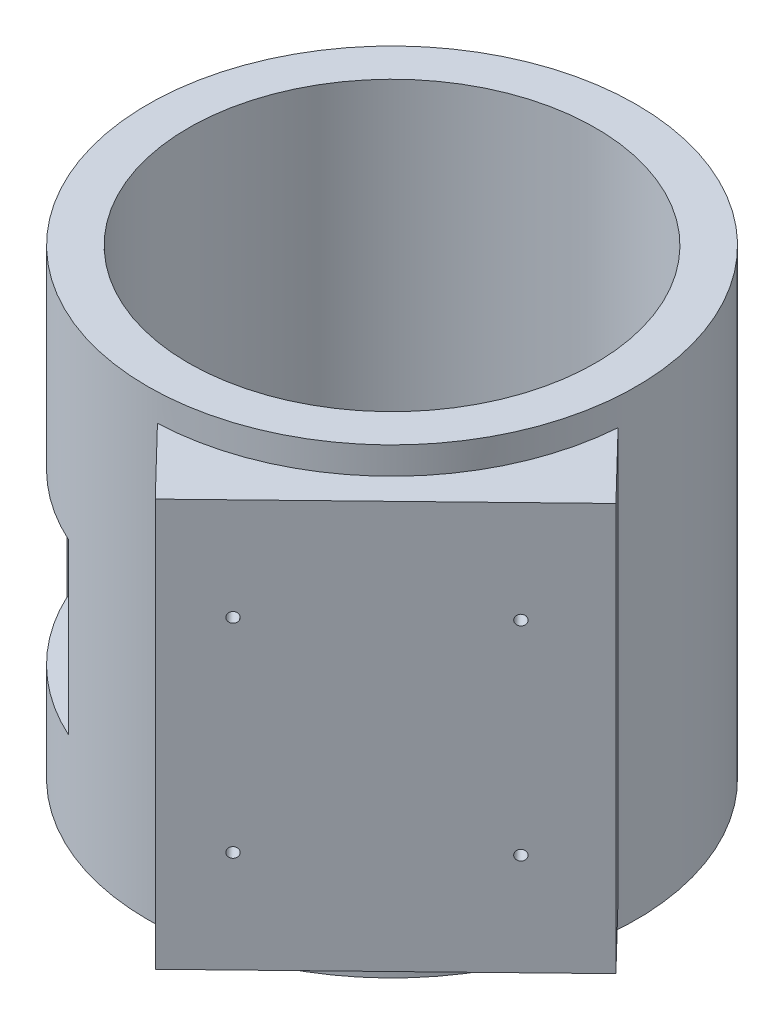
ISO-10303-21;
HEADER;
FILE_DESCRIPTION(('STEP AP214'),'2;1');
FILE_NAME('part.step','',(''),(''),'','','');
FILE_SCHEMA(('AUTOMOTIVE_DESIGN { 1 0 10303 214 1 1 1 1 }'));
ENDSEC;
DATA;
#1=APPLICATION_CONTEXT('core data for automotive mechanical design processes');
#2=APPLICATION_PROTOCOL_DEFINITION('international standard','automotive_design',2000,#1);
#3=PRODUCT_CONTEXT('',#1,'mechanical');
#4=PRODUCT('Part','Part','',(#3));
#5=PRODUCT_RELATED_PRODUCT_CATEGORY('part','',(#4));
#6=PRODUCT_DEFINITION_FORMATION('','',#4);
#7=PRODUCT_DEFINITION_CONTEXT('part definition',#1,'design');
#8=PRODUCT_DEFINITION('design','',#6,#7);
#9=PRODUCT_DEFINITION_SHAPE('','',#8);
#10=(LENGTH_UNIT() NAMED_UNIT(*) SI_UNIT(.MILLI.,.METRE.));
#11=(NAMED_UNIT(*) PLANE_ANGLE_UNIT() SI_UNIT($,.RADIAN.));
#12=(NAMED_UNIT(*) SI_UNIT($,.STERADIAN.) SOLID_ANGLE_UNIT());
#13=UNCERTAINTY_MEASURE_WITH_UNIT(LENGTH_MEASURE(1.E-05),#10,'distance_accuracy_value','');
#14=(GEOMETRIC_REPRESENTATION_CONTEXT(3) GLOBAL_UNCERTAINTY_ASSIGNED_CONTEXT((#13)) GLOBAL_UNIT_ASSIGNED_CONTEXT((#10,
#11,#12)) REPRESENTATION_CONTEXT('',''));
#15=CARTESIAN_POINT('',(0.,0.,0.));
#16=DIRECTION('',(0.,0.,1.));
#17=DIRECTION('',(1.,0.,0.));
#18=AXIS2_PLACEMENT_3D('',#15,#16,#17);
#19=CARTESIAN_POINT('',(0.,226.75,0.));
#20=DIRECTION('',(0.,1.,0.));
#21=DIRECTION('',(0.,0.,1.));
#22=AXIS2_PLACEMENT_3D('',#19,#20,#21);
#23=PLANE('',#22);
#24=CARTESIAN_POINT('',(0.,226.75,0.));
#25=DIRECTION('',(0.,1.,0.));
#26=DIRECTION('',(0.,0.,1.));
#27=AXIS2_PLACEMENT_3D('',#24,#25,#26);
#28=CIRCLE('',#27,120.);
#29=CARTESIAN_POINT('',(0.,226.75,120.));
#30=VERTEX_POINT('',#29);
#31=EDGE_CURVE('E187',#30,#30,#28,.T.);
#32=ORIENTED_EDGE('',*,*,#31,.T.);
#33=EDGE_LOOP('',(#32));
#34=FACE_BOUND('',#33,.T.);
#35=CARTESIAN_POINT('',(0.,226.75,0.));
#36=DIRECTION('',(0.,1.,0.));
#37=DIRECTION('',(0.,0.,1.));
#38=AXIS2_PLACEMENT_3D('',#35,#36,#37);
#39=CIRCLE('',#38,100.);
#40=CARTESIAN_POINT('',(0.,226.75,100.));
#41=VERTEX_POINT('',#40);
#42=EDGE_CURVE('E178',#41,#41,#39,.T.);
#43=ORIENTED_EDGE('',*,*,#42,.F.);
#44=EDGE_LOOP('',(#43));
#45=FACE_BOUND('',#44,.T.);
#46=ADVANCED_FACE('F35',(#34,#45),#23,.T.);
#47=CARTESIAN_POINT('',(0.,0.,0.));
#48=DIRECTION('',(0.,1.,0.));
#49=DIRECTION('',(0.,0.,1.));
#50=AXIS2_PLACEMENT_3D('',#47,#48,#49);
#51=PLANE('',#50);
#52=CARTESIAN_POINT('',(78.4325905729144,0.,-69.9186831342492));
#53=DIRECTION('',(0.,-1.,0.));
#54=DIRECTION('',(0.,0.,-1.));
#55=AXIS2_PLACEMENT_3D('',#52,#53,#54);
#56=CIRCLE('',#55,5.00000000000002);
#57=CARTESIAN_POINT('',(78.4325905729144,0.,-74.9186831342493));
#58=VERTEX_POINT('',#57);
#59=EDGE_CURVE('E369',#58,#58,#56,.T.);
#60=ORIENTED_EDGE('',*,*,#59,.F.);
#61=EDGE_LOOP('',(#60));
#62=FACE_BOUND('',#61,.T.);
#63=CARTESIAN_POINT('',(73.5102920280524,0.,78.4921351272082));
#64=DIRECTION('',(0.,-1.,0.));
#65=DIRECTION('',(0.,0.,-1.));
#66=AXIS2_PLACEMENT_3D('',#63,#64,#65);
#67=CIRCLE('',#66,5.00000000000001);
#68=CARTESIAN_POINT('',(73.5102920280524,0.,73.4921351272082));
#69=VERTEX_POINT('',#68);
#70=EDGE_CURVE('E368',#69,#69,#67,.T.);
#71=ORIENTED_EDGE('',*,*,#70,.F.);
#72=EDGE_LOOP('',(#71));
#73=FACE_BOUND('',#72,.T.);
#74=CARTESIAN_POINT('',(0.,0.,0.));
#75=DIRECTION('',(0.,1.,0.));
#76=DIRECTION('',(0.,0.,1.));
#77=AXIS2_PLACEMENT_3D('',#74,#75,#76);
#78=CIRCLE('',#77,120.);
#79=CARTESIAN_POINT('',(0.,0.,120.));
#80=VERTEX_POINT('',#79);
#81=EDGE_CURVE('E182',#80,#80,#78,.T.);
#82=ORIENTED_EDGE('',*,*,#81,.F.);
#83=EDGE_LOOP('',(#82));
#84=FACE_BOUND('',#83,.T.);
#85=CARTESIAN_POINT('',(0.,0.,0.));
#86=DIRECTION('',(0.,1.,0.));
#87=DIRECTION('',(0.,0.,1.));
#88=AXIS2_PLACEMENT_3D('',#85,#86,#87);
#89=CIRCLE('',#88,100.);
#90=CARTESIAN_POINT('',(-71.1105775900295,0.,70.3085041429015));
#91=VERTEX_POINT('',#90);
#92=CARTESIAN_POINT('',(-65.0944073913111,0.,-75.9125689617604));
#93=VERTEX_POINT('',#92);
#94=EDGE_CURVE('E179',#91,#93,#89,.T.);
#95=ORIENTED_EDGE('',*,*,#94,.T.);
#96=CARTESIAN_POINT('',(-69.9782276885435,0.,-74.8409816791089));
#97=DIRECTION('',(0.,-1.,0.));
#98=DIRECTION('',(0.,0.,-1.));
#99=AXIS2_PLACEMENT_3D('',#96,#97,#98);
#100=CIRCLE('',#99,5.00000000000001);
#101=CARTESIAN_POINT('',(-71.3750107303439,0.,-70.0400445691127));
#102=VERTEX_POINT('',#101);
#103=EDGE_CURVE('E177',#102,#93,#100,.T.);
#104=ORIENTED_EDGE('',*,*,#103,.F.);
#105=CARTESIAN_POINT('',(-71.5717871138831,0.,69.8389525216766));
#106=VERTEX_POINT('',#105);
#107=EDGE_CURVE('E171',#102,#106,#89,.T.);
#108=ORIENTED_EDGE('',*,*,#107,.T.);
#109=CARTESIAN_POINT('',(-74.900526233403,0.,73.5698365823488));
#110=DIRECTION('',(0.,-1.,0.));
#111=DIRECTION('',(0.,0.,-1.));
#112=AXIS2_PLACEMENT_3D('',#109,#110,#111);
#113=CIRCLE('',#112,5.00000000000001);
#114=EDGE_CURVE('E152',#91,#106,#113,.T.);
#115=ORIENTED_EDGE('',*,*,#114,.F.);
#116=EDGE_LOOP('',(#95,#104,#108,#115));
#117=FACE_BOUND('',#116,.T.);
#118=ADVANCED_FACE('F176',(#62,#73,#84,#117),#51,.F.);
#119=CARTESIAN_POINT('',(0.,226.75,0.));
#120=DIRECTION('',(0.,-1.,0.));
#121=DIRECTION('',(0.,0.,-1.));
#122=AXIS2_PLACEMENT_3D('',#119,#120,#121);
#123=CYLINDRICAL_SURFACE('',#122,120.);
#124=DIRECTION('',(0.,-1.,0.));
#125=VECTOR('',#124,1.);
#126=CARTESIAN_POINT('',(-108.663981558483,226.75,50.9130544345721));
#127=LINE('',#126,#125);
#128=CARTESIAN_POINT('',(-108.663981558483,48.41,50.9130544345721));
#129=VERTEX_POINT('',#128);
#130=CARTESIAN_POINT('',(-108.663981558483,131.41,50.9130544345721));
#131=VERTEX_POINT('',#130);
#132=EDGE_CURVE('E401',#129,#131,#127,.F.);
#133=ORIENTED_EDGE('',*,*,#132,.T.);
#134=CARTESIAN_POINT('',(0.,131.41,0.));
#135=DIRECTION('',(0.,1.,0.));
#136=DIRECTION('',(0.,0.,1.));
#137=AXIS2_PLACEMENT_3D('',#134,#135,#136);
#138=CIRCLE('',#137,120.);
#139=CARTESIAN_POINT('',(-49.608939813541,131.41,109.265516475128));
#140=VERTEX_POINT('',#139);
#141=EDGE_CURVE('E391',#131,#140,#138,.T.);
#142=ORIENTED_EDGE('',*,*,#141,.T.);
#143=DIRECTION('',(0.,-1.,0.));
#144=VECTOR('',#143,1.);
#145=CARTESIAN_POINT('',(-49.608939813541,226.75,109.265516475128));
#146=LINE('',#145,#144);
#147=CARTESIAN_POINT('',(-49.608939813541,48.41,109.265516475128));
#148=VERTEX_POINT('',#147);
#149=EDGE_CURVE('E202',#140,#148,#146,.T.);
#150=ORIENTED_EDGE('',*,*,#149,.T.);
#151=CARTESIAN_POINT('',(0.,48.41,0.));
#152=DIRECTION('',(0.,-1.,0.));
#153=DIRECTION('',(0.,0.,-1.));
#154=AXIS2_PLACEMENT_3D('',#151,#152,#153);
#155=CIRCLE('',#154,120.);
#156=EDGE_CURVE('E404',#148,#129,#155,.T.);
#157=ORIENTED_EDGE('',*,*,#156,.T.);
#158=EDGE_LOOP('',(#133,#142,#150,#157));
#159=FACE_BOUND('',#158,.T.);
#160=CARTESIAN_POINT('',(0.,213.414213562373,0.));
#161=DIRECTION('',(0.,1.,0.));
#162=DIRECTION('',(-1.,0.,0.));
#163=AXIS2_PLACEMENT_3D('',#160,#161,#162);
#164=CIRCLE('',#163,120.);
#165=CARTESIAN_POINT('',(4.6899926602656,213.414213562373,119.908314844495));
#166=VERTEX_POINT('',#165);
#167=CARTESIAN_POINT('',(119.686951655469,213.414213562374,8.66219391501968));
#168=VERTEX_POINT('',#167);
#169=EDGE_CURVE('E481',#166,#168,#164,.T.);
#170=ORIENTED_EDGE('',*,*,#169,.T.);
#171=DIRECTION('',(0.,-1.,0.));
#172=VECTOR('',#171,1.);
#173=CARTESIAN_POINT('',(119.686951655469,226.75,8.66219391501962));
#174=LINE('',#173,#172);
#175=CARTESIAN_POINT('',(119.686951655469,13.4142135623721,8.6621939150195));
#176=VERTEX_POINT('',#175);
#177=EDGE_CURVE('E184',#168,#176,#174,.T.);
#178=ORIENTED_EDGE('',*,*,#177,.T.);
#179=CARTESIAN_POINT('',(0.,13.4142135623726,0.));
#180=DIRECTION('',(0.,-1.,0.));
#181=DIRECTION('',(1.,0.,0.));
#182=AXIS2_PLACEMENT_3D('',#179,#180,#181);
#183=CIRCLE('',#182,120.);
#184=CARTESIAN_POINT('',(4.68999266026526,13.4142135623732,119.908314844496));
#185=VERTEX_POINT('',#184);
#186=EDGE_CURVE('E492',#176,#185,#183,.T.);
#187=ORIENTED_EDGE('',*,*,#186,.T.);
#188=DIRECTION('',(0.,-1.,0.));
#189=VECTOR('',#188,1.);
#190=CARTESIAN_POINT('',(4.68999266026567,226.75,119.908314844495));
#191=LINE('',#190,#189);
#192=EDGE_CURVE('E489',#185,#166,#191,.F.);
#193=ORIENTED_EDGE('',*,*,#192,.T.);
#194=EDGE_LOOP('',(#170,#178,#187,#193));
#195=FACE_BOUND('',#194,.T.);
#196=ORIENTED_EDGE('',*,*,#31,.F.);
#197=EDGE_LOOP('',(#196));
#198=FACE_BOUND('',#197,.T.);
#199=ORIENTED_EDGE('',*,*,#81,.T.);
#200=EDGE_LOOP('',(#199));
#201=FACE_BOUND('',#200,.T.);
#202=ADVANCED_FACE('F37',(#159,#195,#198,#201),#123,.T.);
#203=CARTESIAN_POINT('',(0.,226.75,0.));
#204=DIRECTION('',(0.,-1.,0.));
#205=DIRECTION('',(0.,0.,-1.));
#206=AXIS2_PLACEMENT_3D('',#203,#204,#205);
#207=CYLINDRICAL_SURFACE('',#206,100.);
#208=DIRECTION('',(0.,-1.,0.));
#209=VECTOR('',#208,1.);
#210=CARTESIAN_POINT('',(-65.0944073913111,10.,-75.9125689617604));
#211=LINE('',#210,#209);
#212=CARTESIAN_POINT('',(-65.0944073913111,20.,-75.9125689617604));
#213=VERTEX_POINT('',#212);
#214=EDGE_CURVE('E11',#93,#213,#211,.F.);
#215=ORIENTED_EDGE('',*,*,#214,.F.);
#216=ORIENTED_EDGE('',*,*,#94,.F.);
#217=DIRECTION('',(0.,-1.,0.));
#218=VECTOR('',#217,1.);
#219=CARTESIAN_POINT('',(-71.1105775900265,10.,70.308504142905));
#220=LINE('',#219,#218);
#221=CARTESIAN_POINT('',(-71.1105775900295,20.,70.3085041429015));
#222=VERTEX_POINT('',#221);
#223=EDGE_CURVE('E158',#222,#91,#220,.T.);
#224=ORIENTED_EDGE('',*,*,#223,.F.);
#225=CARTESIAN_POINT('',(0.,20.,0.));
#226=DIRECTION('',(0.,-1.,0.));
#227=DIRECTION('',(0.,0.,-1.));
#228=AXIS2_PLACEMENT_3D('',#225,#226,#227);
#229=CIRCLE('',#228,100.);
#230=CARTESIAN_POINT('',(-71.5717871138831,20.,69.8389525216766));
#231=VERTEX_POINT('',#230);
#232=EDGE_CURVE('E172',#222,#231,#229,.T.);
#233=ORIENTED_EDGE('',*,*,#232,.T.);
#234=DIRECTION('',(0.,-1.,0.));
#235=VECTOR('',#234,1.);
#236=CARTESIAN_POINT('',(-71.5717871138865,10.,69.8389525216736));
#237=LINE('',#236,#235);
#238=EDGE_CURVE('E155',#106,#231,#237,.F.);
#239=ORIENTED_EDGE('',*,*,#238,.F.);
#240=ORIENTED_EDGE('',*,*,#107,.F.);
#241=DIRECTION('',(0.,-1.,0.));
#242=VECTOR('',#241,1.);
#243=CARTESIAN_POINT('',(-71.3750107303439,10.,-70.0400445691127));
#244=LINE('',#243,#242);
#245=CARTESIAN_POINT('',(-71.3750107303439,20.,-70.0400445691127));
#246=VERTEX_POINT('',#245);
#247=EDGE_CURVE('E43',#246,#102,#244,.T.);
#248=ORIENTED_EDGE('',*,*,#247,.F.);
#249=CARTESIAN_POINT('',(0.,20.,0.));
#250=DIRECTION('',(0.,-1.,0.));
#251=DIRECTION('',(0.,0.,-1.));
#252=AXIS2_PLACEMENT_3D('',#249,#250,#251);
#253=CIRCLE('',#252,100.);
#254=EDGE_CURVE('E173',#246,#213,#253,.T.);
#255=ORIENTED_EDGE('',*,*,#254,.T.);
#256=EDGE_LOOP('',(#215,#216,#224,#233,#239,#240,#248,#255));
#257=FACE_BOUND('',#256,.T.);
#258=CARTESIAN_POINT('',(0.,48.41,0.));
#259=DIRECTION('',(0.,-1.,0.));
#260=DIRECTION('',(0.,0.,-1.));
#261=AXIS2_PLACEMENT_3D('',#258,#259,#260);
#262=CIRCLE('',#261,100.);
#263=CARTESIAN_POINT('',(-36.5772958110317,48.41,93.0704111474333));
#264=VERTEX_POINT('',#263);
#265=CARTESIAN_POINT('',(-93.2824171625184,48.41,36.0331881508964));
#266=VERTEX_POINT('',#265);
#267=EDGE_CURVE('E200',#264,#266,#262,.T.);
#268=ORIENTED_EDGE('',*,*,#267,.F.);
#269=DIRECTION('',(0.,-1.,0.));
#270=VECTOR('',#269,1.);
#271=CARTESIAN_POINT('',(-36.5772958110317,226.75,93.0704111474333));
#272=LINE('',#271,#270);
#273=CARTESIAN_POINT('',(-36.5772958110317,131.41,93.0704111474333));
#274=VERTEX_POINT('',#273);
#275=EDGE_CURVE('E190',#264,#274,#272,.F.);
#276=ORIENTED_EDGE('',*,*,#275,.T.);
#277=CARTESIAN_POINT('',(0.,131.41,0.));
#278=DIRECTION('',(0.,1.,0.));
#279=DIRECTION('',(0.,0.,1.));
#280=AXIS2_PLACEMENT_3D('',#277,#278,#279);
#281=CIRCLE('',#280,100.);
#282=CARTESIAN_POINT('',(-93.2824171625184,131.41,36.0331881508964));
#283=VERTEX_POINT('',#282);
#284=EDGE_CURVE('E195',#283,#274,#281,.T.);
#285=ORIENTED_EDGE('',*,*,#284,.F.);
#286=DIRECTION('',(0.,-1.,0.));
#287=VECTOR('',#286,1.);
#288=CARTESIAN_POINT('',(-93.2824171625184,226.75,36.0331881508963));
#289=LINE('',#288,#287);
#290=EDGE_CURVE('E198',#266,#283,#289,.F.);
#291=ORIENTED_EDGE('',*,*,#290,.F.);
#292=EDGE_LOOP('',(#268,#276,#285,#291));
#293=FACE_BOUND('',#292,.T.);
#294=ORIENTED_EDGE('',*,*,#42,.T.);
#295=EDGE_LOOP('',(#294));
#296=FACE_BOUND('',#295,.T.);
#297=CARTESIAN_POINT('',(0.,203.414213562373,0.));
#298=DIRECTION('',(0.,1.,0.));
#299=DIRECTION('',(0.,0.,1.));
#300=AXIS2_PLACEMENT_3D('',#297,#298,#299);
#301=CIRCLE('',#300,99.9999999999977);
#302=CARTESIAN_POINT('',(-0.657656399723929,203.414213562373,99.9978374169134));
#303=VERTEX_POINT('',#302);
#304=CARTESIAN_POINT('',(99.9646827210788,203.414213562373,2.65748160362182));
#305=VERTEX_POINT('',#304);
#306=EDGE_CURVE('E446',#303,#305,#301,.T.);
#307=ORIENTED_EDGE('',*,*,#306,.F.);
#308=DIRECTION('',(0.,1.,0.));
#309=VECTOR('',#308,1.);
#310=CARTESIAN_POINT('',(-0.657656399723934,0.,99.9978374169134));
#311=LINE('',#310,#309);
#312=CARTESIAN_POINT('',(-0.657656399723906,23.414213562373,99.9978374169134));
#313=VERTEX_POINT('',#312);
#314=EDGE_CURVE('E445',#313,#303,#311,.T.);
#315=ORIENTED_EDGE('',*,*,#314,.F.);
#316=CARTESIAN_POINT('',(0.,23.4142135623732,0.));
#317=DIRECTION('',(0.,-1.,0.));
#318=DIRECTION('',(1.,0.,0.));
#319=AXIS2_PLACEMENT_3D('',#316,#317,#318);
#320=CIRCLE('',#319,99.9999999999977);
#321=CARTESIAN_POINT('',(99.9646827210788,23.4142135623735,2.65748160362216));
#322=VERTEX_POINT('',#321);
#323=EDGE_CURVE('E442',#322,#313,#320,.T.);
#324=ORIENTED_EDGE('',*,*,#323,.F.);
#325=DIRECTION('',(0.,1.,0.));
#326=VECTOR('',#325,1.);
#327=CARTESIAN_POINT('',(99.9646827210788,0.,2.65748160362216));
#328=LINE('',#327,#326);
#329=EDGE_CURVE('E449',#305,#322,#328,.F.);
#330=ORIENTED_EDGE('',*,*,#329,.F.);
#331=EDGE_LOOP('',(#307,#315,#324,#330));
#332=FACE_BOUND('',#331,.T.);
#333=ADVANCED_FACE('F168',(#257,#293,#296,#332),#207,.F.);
#334=CARTESIAN_POINT('',(-67.6679309128779,23.4142135623732,-170.627129448513));
#335=DIRECTION('',(0.718730993720023,0.,-0.69528825580922));
#336=DIRECTION('',(-0.69528825580922,0.,-0.718730993720023));
#337=AXIS2_PLACEMENT_3D('',#334,#335,#336);
#338=PLANE('',#337);
#339=DIRECTION('',(0.69528825580922,0.,0.718730993720023));
#340=VECTOR('',#339,1.);
#341=CARTESIAN_POINT('',(-67.6679309128777,203.414213562373,-170.627129448514));
#342=LINE('',#341,#340);
#343=CARTESIAN_POINT('',(137.250013066787,203.414213562373,41.1999455481055));
#344=VERTEX_POINT('',#343);
#345=EDGE_CURVE('E474',#305,#344,#342,.T.);
#346=ORIENTED_EDGE('',*,*,#345,.F.);
#347=ORIENTED_EDGE('',*,*,#329,.T.);
#348=DIRECTION('',(0.69528825580922,0.,0.718730993720023));
#349=VECTOR('',#348,1.);
#350=CARTESIAN_POINT('',(-67.6679309128779,23.4142135623732,-170.627129448513));
#351=LINE('',#350,#349);
#352=CARTESIAN_POINT('',(137.250013066786,23.4142135623732,41.1999455481056));
#353=VERTEX_POINT('',#352);
#354=EDGE_CURVE('E466',#322,#353,#351,.T.);
#355=ORIENTED_EDGE('',*,*,#354,.T.);
#356=DIRECTION('',(0.,1.,0.));
#357=VECTOR('',#356,1.);
#358=CARTESIAN_POINT('',(137.250013066786,23.4142135623732,41.1999455481056));
#359=LINE('',#358,#357);
#360=EDGE_CURVE('E454',#353,#344,#359,.T.);
#361=ORIENTED_EDGE('',*,*,#360,.T.);
#362=EDGE_LOOP('',(#346,#347,#355,#361));
#363=FACE_BOUND('',#362,.T.);
#364=ADVANCED_FACE('F236',(#363),#338,.F.);
#365=CARTESIAN_POINT('',(-128.76006537908,203.414213562373,-111.52762770473));
#366=DIRECTION('',(0.,1.,0.));
#367=DIRECTION('',(0.,0.,1.));
#368=AXIS2_PLACEMENT_3D('',#365,#366,#367);
#369=PLANE('',#368);
#370=DIRECTION('',(0.69528825580922,0.,0.718730993720023));
#371=VECTOR('',#370,1.);
#372=CARTESIAN_POINT('',(-168.290270033681,203.414213562373,-73.2867736352227));
#373=LINE('',#372,#371);
#374=CARTESIAN_POINT('',(36.6276739459833,203.414213562373,138.540301361396));
#375=VERTEX_POINT('',#374);
#376=EDGE_CURVE('E471',#303,#375,#373,.T.);
#377=ORIENTED_EDGE('',*,*,#376,.F.);
#378=ORIENTED_EDGE('',*,*,#306,.T.);
#379=ORIENTED_EDGE('',*,*,#345,.T.);
#380=DIRECTION('',(-0.718730993720023,0.,0.69528825580922));
#381=VECTOR('',#380,1.);
#382=CARTESIAN_POINT('',(76.1578786005845,203.414213562373,100.299447291889));
#383=LINE('',#382,#381);
#384=EDGE_CURVE('E457',#344,#375,#383,.T.);
#385=ORIENTED_EDGE('',*,*,#384,.T.);
#386=EDGE_LOOP('',(#377,#378,#379,#385));
#387=FACE_BOUND('',#386,.T.);
#388=ADVANCED_FACE('F257',(#387),#369,.F.);
#389=CARTESIAN_POINT('',(-168.290270033681,203.414213562373,-73.2867736352227));
#390=DIRECTION('',(-0.718730993720023,0.,0.69528825580922));
#391=DIRECTION('',(0.69528825580922,0.,0.718730993720023));
#392=AXIS2_PLACEMENT_3D('',#389,#390,#391);
#393=PLANE('',#392);
#394=DIRECTION('',(0.69528825580922,0.,0.718730993720023));
#395=VECTOR('',#394,1.);
#396=CARTESIAN_POINT('',(-168.290270033681,23.414213562373,-73.2867736352227));
#397=LINE('',#396,#395);
#398=CARTESIAN_POINT('',(36.6276739459834,23.4142135623729,138.540301361396));
#399=VERTEX_POINT('',#398);
#400=EDGE_CURVE('E467',#313,#399,#397,.T.);
#401=ORIENTED_EDGE('',*,*,#400,.F.);
#402=ORIENTED_EDGE('',*,*,#314,.T.);
#403=ORIENTED_EDGE('',*,*,#376,.T.);
#404=DIRECTION('',(0.,-1.,0.));
#405=VECTOR('',#404,1.);
#406=CARTESIAN_POINT('',(36.6276739459832,203.414213562373,138.540301361396));
#407=LINE('',#406,#405);
#408=EDGE_CURVE('E460',#375,#399,#407,.T.);
#409=ORIENTED_EDGE('',*,*,#408,.T.);
#410=EDGE_LOOP('',(#401,#402,#403,#409));
#411=FACE_BOUND('',#410,.T.);
#412=ADVANCED_FACE('F261',(#411),#393,.F.);
#413=CARTESIAN_POINT('',(-168.290270033681,23.414213562373,-73.2867736352227));
#414=DIRECTION('',(0.,-1.,0.));
#415=DIRECTION('',(1.,0.,0.));
#416=AXIS2_PLACEMENT_3D('',#413,#414,#415);
#417=PLANE('',#416);
#418=ORIENTED_EDGE('',*,*,#354,.F.);
#419=ORIENTED_EDGE('',*,*,#323,.T.);
#420=ORIENTED_EDGE('',*,*,#400,.T.);
#421=DIRECTION('',(0.718730993720025,0.,-0.695288255809218));
#422=VECTOR('',#421,1.);
#423=CARTESIAN_POINT('',(36.627673945983,23.4142135623729,138.540301361396));
#424=LINE('',#423,#422);
#425=EDGE_CURVE('E463',#399,#353,#424,.T.);
#426=ORIENTED_EDGE('',*,*,#425,.T.);
#427=EDGE_LOOP('',(#418,#419,#420,#426));
#428=FACE_BOUND('',#427,.T.);
#429=ADVANCED_FACE('F247',(#428),#417,.F.);
#430=CARTESIAN_POINT('',(-60.4806209756777,213.414213562374,-177.580012006606));
#431=DIRECTION('',(0.718730993720023,0.,-0.69528825580922));
#432=DIRECTION('',(-0.69528825580922,0.,-0.718730993720023));
#433=AXIS2_PLACEMENT_3D('',#430,#431,#432);
#434=PLANE('',#433);
#435=ORIENTED_EDGE('',*,*,#177,.F.);
#436=DIRECTION('',(0.69528825580922,0.,0.718730993720023));
#437=VECTOR('',#436,1.);
#438=CARTESIAN_POINT('',(-60.4806209756777,213.414213562374,-177.580012006606));
#439=LINE('',#438,#437);
#440=CARTESIAN_POINT('',(151.390205562079,213.414213562374,41.4343729272136));
#441=VERTEX_POINT('',#440);
#442=EDGE_CURVE('E484',#168,#441,#439,.T.);
#443=ORIENTED_EDGE('',*,*,#442,.T.);
#444=DIRECTION('',(0.,1.,0.));
#445=VECTOR('',#444,1.);
#446=CARTESIAN_POINT('',(151.390205562079,13.4142135623723,41.4343729272137));
#447=LINE('',#446,#445);
#448=CARTESIAN_POINT('',(151.390205562079,13.4142135623723,41.4343729272137));
#449=VERTEX_POINT('',#448);
#450=EDGE_CURVE('E436',#449,#441,#447,.T.);
#451=ORIENTED_EDGE('',*,*,#450,.F.);
#452=DIRECTION('',(0.69528825580922,0.,0.718730993720023));
#453=VECTOR('',#452,1.);
#454=CARTESIAN_POINT('',(-60.4806209756777,13.4142135623723,-177.580012006606));
#455=LINE('',#454,#453);
#456=EDGE_CURVE('E470',#176,#449,#455,.T.);
#457=ORIENTED_EDGE('',*,*,#456,.F.);
#458=EDGE_LOOP('',(#435,#443,#451,#457));
#459=FACE_BOUND('',#458,.T.);
#460=ADVANCED_FACE('F243',(#459),#434,.T.);
#461=CARTESIAN_POINT('',(-175.477579970882,13.4142135623732,-66.3338910771298));
#462=DIRECTION('',(-0.718730993720023,0.,0.69528825580922));
#463=DIRECTION('',(0.69528825580922,0.,0.718730993720023));
#464=AXIS2_PLACEMENT_3D('',#461,#462,#463);
#465=PLANE('',#464);
#466=ORIENTED_EDGE('',*,*,#192,.F.);
#467=DIRECTION('',(0.69528825580922,0.,0.718730993720023));
#468=VECTOR('',#467,1.);
#469=CARTESIAN_POINT('',(-175.477579970882,13.4142135623732,-66.3338910771298));
#470=LINE('',#469,#468);
#471=CARTESIAN_POINT('',(36.3932465668747,13.4142135623731,152.680493856689));
#472=VERTEX_POINT('',#471);
#473=EDGE_CURVE('E479',#185,#472,#470,.T.);
#474=ORIENTED_EDGE('',*,*,#473,.T.);
#475=DIRECTION('',(0.,-1.,0.));
#476=VECTOR('',#475,1.);
#477=CARTESIAN_POINT('',(36.3932465668751,213.414213562373,152.680493856689));
#478=LINE('',#477,#476);
#479=CARTESIAN_POINT('',(36.3932465668751,213.414213562373,152.680493856689));
#480=VERTEX_POINT('',#479);
#481=EDGE_CURVE('E430',#480,#472,#478,.T.);
#482=ORIENTED_EDGE('',*,*,#481,.F.);
#483=DIRECTION('',(0.69528825580922,0.,0.718730993720023));
#484=VECTOR('',#483,1.);
#485=CARTESIAN_POINT('',(-175.477579970881,213.414213562373,-66.3338910771302));
#486=LINE('',#485,#484);
#487=EDGE_CURVE('E482',#166,#480,#486,.T.);
#488=ORIENTED_EDGE('',*,*,#487,.F.);
#489=EDGE_LOOP('',(#466,#474,#482,#488));
#490=FACE_BOUND('',#489,.T.);
#491=ADVANCED_FACE('F246',(#490),#465,.T.);
#492=CARTESIAN_POINT('',(-175.477579970881,213.414213562373,-66.3338910771302));
#493=DIRECTION('',(0.,1.,0.));
#494=DIRECTION('',(-1.,0.,0.));
#495=AXIS2_PLACEMENT_3D('',#492,#493,#494);
#496=PLANE('',#495);
#497=ORIENTED_EDGE('',*,*,#169,.F.);
#498=ORIENTED_EDGE('',*,*,#487,.T.);
#499=DIRECTION('',(-0.718730993720023,0.,0.695288255809221));
#500=VECTOR('',#499,1.);
#501=CARTESIAN_POINT('',(151.390205562079,213.414213562374,41.4343729272136));
#502=LINE('',#501,#500);
#503=EDGE_CURVE('E439',#441,#480,#502,.T.);
#504=ORIENTED_EDGE('',*,*,#503,.F.);
#505=ORIENTED_EDGE('',*,*,#442,.F.);
#506=EDGE_LOOP('',(#497,#498,#504,#505));
#507=FACE_BOUND('',#506,.T.);
#508=ADVANCED_FACE('F241',(#507),#496,.T.);
#509=CARTESIAN_POINT('',(-60.4806209756777,13.4142135623723,-177.580012006606));
#510=DIRECTION('',(0.,-1.,0.));
#511=DIRECTION('',(1.,0.,0.));
#512=AXIS2_PLACEMENT_3D('',#509,#510,#511);
#513=PLANE('',#512);
#514=ORIENTED_EDGE('',*,*,#186,.F.);
#515=ORIENTED_EDGE('',*,*,#456,.T.);
#516=DIRECTION('',(0.718730993720023,0.,-0.69528825580922));
#517=VECTOR('',#516,1.);
#518=CARTESIAN_POINT('',(36.3932465668747,13.4142135623731,152.680493856689));
#519=LINE('',#518,#517);
#520=EDGE_CURVE('E433',#472,#449,#519,.T.);
#521=ORIENTED_EDGE('',*,*,#520,.F.);
#522=ORIENTED_EDGE('',*,*,#473,.F.);
#523=EDGE_LOOP('',(#514,#515,#521,#522));
#524=FACE_BOUND('',#523,.T.);
#525=ADVANCED_FACE('F237',(#524),#513,.T.);
#526=CARTESIAN_POINT('',(93.8917260644768,0.,97.0574333919515));
#527=DIRECTION('',(0.69528825580922,0.,0.718730993720023));
#528=DIRECTION('',(0.718730993720023,0.,-0.69528825580922));
#529=AXIS2_PLACEMENT_3D('',#526,#527,#528);
#530=PLANE('',#529);
#531=CARTESIAN_POINT('',(127.672082769318,63.4142135623727,64.378885368918));
#532=DIRECTION('',(0.695288255809221,0.,0.718730993720023));
#533=DIRECTION('',(0.718730993720023,0.,-0.695288255809221));
#534=AXIS2_PLACEMENT_3D('',#531,#532,#533);
#535=CIRCLE('',#534,2.49999999999998);
#536=CARTESIAN_POINT('',(129.468910253618,63.4142135623727,62.640664729395));
#537=VERTEX_POINT('',#536);
#538=EDGE_CURVE('E416',#537,#537,#535,.T.);
#539=ORIENTED_EDGE('',*,*,#538,.F.);
#540=EDGE_LOOP('',(#539));
#541=FACE_BOUND('',#540,.T.);
#542=CARTESIAN_POINT('',(55.7989833973156,163.414213562373,133.90771094984));
#543=DIRECTION('',(0.695288255809221,0.,0.718730993720023));
#544=DIRECTION('',(0.718730993720023,0.,-0.695288255809221));
#545=AXIS2_PLACEMENT_3D('',#542,#543,#544);
#546=CIRCLE('',#545,2.50000000000001);
#547=CARTESIAN_POINT('',(57.5958108816157,163.414213562373,132.169490310317));
#548=VERTEX_POINT('',#547);
#549=EDGE_CURVE('E417',#548,#548,#546,.T.);
#550=ORIENTED_EDGE('',*,*,#549,.F.);
#551=EDGE_LOOP('',(#550));
#552=FACE_BOUND('',#551,.T.);
#553=CARTESIAN_POINT('',(55.7989833973156,63.4142135623725,133.90771094984));
#554=DIRECTION('',(0.695288255809221,0.,0.718730993720023));
#555=DIRECTION('',(0.718730993720023,0.,-0.695288255809221));
#556=AXIS2_PLACEMENT_3D('',#553,#554,#555);
#557=CIRCLE('',#556,2.49999999999999);
#558=CARTESIAN_POINT('',(57.5958108816157,63.4142135623725,132.169490310317));
#559=VERTEX_POINT('',#558);
#560=EDGE_CURVE('E409',#559,#559,#557,.T.);
#561=ORIENTED_EDGE('',*,*,#560,.F.);
#562=EDGE_LOOP('',(#561));
#563=FACE_BOUND('',#562,.T.);
#564=CARTESIAN_POINT('',(127.672082769318,163.414213562373,64.3788853689181));
#565=DIRECTION('',(0.695288255809221,0.,0.718730993720023));
#566=DIRECTION('',(0.718730993720023,0.,-0.695288255809221));
#567=AXIS2_PLACEMENT_3D('',#564,#565,#566);
#568=CIRCLE('',#567,2.50000000000002);
#569=CARTESIAN_POINT('',(129.468910253618,163.414213562373,62.640664729395));
#570=VERTEX_POINT('',#569);
#571=EDGE_CURVE('E420',#570,#570,#568,.T.);
#572=ORIENTED_EDGE('',*,*,#571,.F.);
#573=EDGE_LOOP('',(#572));
#574=FACE_BOUND('',#573,.T.);
#575=ORIENTED_EDGE('',*,*,#481,.T.);
#576=ORIENTED_EDGE('',*,*,#520,.T.);
#577=ORIENTED_EDGE('',*,*,#450,.T.);
#578=ORIENTED_EDGE('',*,*,#503,.T.);
#579=EDGE_LOOP('',(#575,#576,#577,#578));
#580=FACE_BOUND('',#579,.T.);
#581=ADVANCED_FACE('F240',(#541,#552,#563,#574,#580),#530,.T.);
#582=CARTESIAN_POINT('',(86.9388435063845,0.,89.8701234547513));
#583=DIRECTION('',(0.69528825580922,0.,0.718730993720023));
#584=DIRECTION('',(0.718730993720023,0.,-0.69528825580922));
#585=AXIS2_PLACEMENT_3D('',#582,#583,#584);
#586=PLANE('',#585);
#587=CARTESIAN_POINT('',(120.719200211226,63.4142135623727,57.1915754317178));
#588=DIRECTION('',(0.69528825580922,0.,0.718730993720023));
#589=DIRECTION('',(0.718730993720023,0.,-0.69528825580922));
#590=AXIS2_PLACEMENT_3D('',#587,#588,#589);
#591=CIRCLE('',#590,2.49999999999998);
#592=CARTESIAN_POINT('',(122.516027695526,63.4142135623727,55.4533547921947));
#593=VERTEX_POINT('',#592);
#594=EDGE_CURVE('E413',#593,#593,#591,.F.);
#595=ORIENTED_EDGE('',*,*,#594,.F.);
#596=EDGE_LOOP('',(#595));
#597=FACE_BOUND('',#596,.T.);
#598=CARTESIAN_POINT('',(48.8461008392234,163.414213562373,126.72040101264));
#599=DIRECTION('',(0.69528825580922,0.,0.718730993720023));
#600=DIRECTION('',(0.718730993720023,0.,-0.69528825580922));
#601=AXIS2_PLACEMENT_3D('',#598,#599,#600);
#602=CIRCLE('',#601,2.50000000000001);
#603=CARTESIAN_POINT('',(50.6429283235235,163.414213562373,124.982180373117));
#604=VERTEX_POINT('',#603);
#605=EDGE_CURVE('E412',#604,#604,#602,.F.);
#606=ORIENTED_EDGE('',*,*,#605,.F.);
#607=EDGE_LOOP('',(#606));
#608=FACE_BOUND('',#607,.T.);
#609=CARTESIAN_POINT('',(48.8461008392234,63.4142135623725,126.72040101264));
#610=DIRECTION('',(0.69528825580922,0.,0.718730993720023));
#611=DIRECTION('',(0.718730993720023,0.,-0.69528825580922));
#612=AXIS2_PLACEMENT_3D('',#609,#610,#611);
#613=CIRCLE('',#612,2.49999999999999);
#614=CARTESIAN_POINT('',(50.6429283235234,63.4142135623725,124.982180373117));
#615=VERTEX_POINT('',#614);
#616=EDGE_CURVE('E406',#615,#615,#613,.F.);
#617=ORIENTED_EDGE('',*,*,#616,.F.);
#618=EDGE_LOOP('',(#617));
#619=FACE_BOUND('',#618,.T.);
#620=CARTESIAN_POINT('',(120.719200211226,163.414213562373,57.1915754317179));
#621=DIRECTION('',(0.69528825580922,0.,0.718730993720023));
#622=DIRECTION('',(0.718730993720023,0.,-0.69528825580922));
#623=AXIS2_PLACEMENT_3D('',#620,#621,#622);
#624=CIRCLE('',#623,2.50000000000002);
#625=CARTESIAN_POINT('',(122.516027695526,163.414213562373,55.4533547921948));
#626=VERTEX_POINT('',#625);
#627=EDGE_CURVE('E427',#626,#626,#624,.F.);
#628=ORIENTED_EDGE('',*,*,#627,.F.);
#629=EDGE_LOOP('',(#628));
#630=FACE_BOUND('',#629,.T.);
#631=ORIENTED_EDGE('',*,*,#384,.F.);
#632=ORIENTED_EDGE('',*,*,#360,.F.);
#633=ORIENTED_EDGE('',*,*,#425,.F.);
#634=ORIENTED_EDGE('',*,*,#408,.F.);
#635=EDGE_LOOP('',(#631,#632,#633,#634));
#636=FACE_BOUND('',#635,.T.);
#637=ADVANCED_FACE('F269',(#597,#608,#619,#630,#636),#586,.F.);
#638=CARTESIAN_POINT('',(-84.1987437684386,163.414213562373,-154.635499564901));
#639=DIRECTION('',(0.695288255809221,0.,0.718730993720023));
#640=DIRECTION('',(0.718730993720023,0.,-0.695288255809221));
#641=AXIS2_PLACEMENT_3D('',#638,#639,#640);
#642=CYLINDRICAL_SURFACE('',#641,2.50000000000002);
#643=ORIENTED_EDGE('',*,*,#571,.T.);
#644=EDGE_LOOP('',(#643));
#645=FACE_BOUND('',#644,.T.);
#646=ORIENTED_EDGE('',*,*,#627,.T.);
#647=EDGE_LOOP('',(#646));
#648=FACE_BOUND('',#647,.T.);
#649=ADVANCED_FACE('F272',(#645,#648),#642,.F.);
#650=CARTESIAN_POINT('',(-156.071843140441,63.4142135623725,-85.1066739839791));
#651=DIRECTION('',(0.695288255809221,0.,0.718730993720023));
#652=DIRECTION('',(0.718730993720023,0.,-0.695288255809221));
#653=AXIS2_PLACEMENT_3D('',#650,#651,#652);
#654=CYLINDRICAL_SURFACE('',#653,2.49999999999999);
#655=ORIENTED_EDGE('',*,*,#560,.T.);
#656=EDGE_LOOP('',(#655));
#657=FACE_BOUND('',#656,.T.);
#658=ORIENTED_EDGE('',*,*,#616,.T.);
#659=EDGE_LOOP('',(#658));
#660=FACE_BOUND('',#659,.T.);
#661=ADVANCED_FACE('F279',(#657,#660),#654,.F.);
#662=CARTESIAN_POINT('',(-156.071843140441,163.414213562373,-85.1066739839791));
#663=DIRECTION('',(0.695288255809221,0.,0.718730993720023));
#664=DIRECTION('',(0.718730993720023,0.,-0.695288255809221));
#665=AXIS2_PLACEMENT_3D('',#662,#663,#664);
#666=CYLINDRICAL_SURFACE('',#665,2.50000000000001);
#667=ORIENTED_EDGE('',*,*,#549,.T.);
#668=EDGE_LOOP('',(#667));
#669=FACE_BOUND('',#668,.T.);
#670=ORIENTED_EDGE('',*,*,#605,.T.);
#671=EDGE_LOOP('',(#670));
#672=FACE_BOUND('',#671,.T.);
#673=ADVANCED_FACE('F281',(#669,#672),#666,.F.);
#674=CARTESIAN_POINT('',(-84.1987437684386,63.4142135623727,-154.635499564901));
#675=DIRECTION('',(0.695288255809221,0.,0.718730993720023));
#676=DIRECTION('',(0.718730993720023,0.,-0.695288255809221));
#677=AXIS2_PLACEMENT_3D('',#674,#675,#676);
#678=CYLINDRICAL_SURFACE('',#677,2.49999999999998);
#679=ORIENTED_EDGE('',*,*,#538,.T.);
#680=EDGE_LOOP('',(#679));
#681=FACE_BOUND('',#680,.T.);
#682=ORIENTED_EDGE('',*,*,#594,.T.);
#683=EDGE_LOOP('',(#682));
#684=FACE_BOUND('',#683,.T.);
#685=ADVANCED_FACE('F284',(#681,#684),#678,.F.);
#686=CARTESIAN_POINT('',(-34.7840256426849,131.41,94.9241442420681));
#687=DIRECTION('',(0.695288255809221,0.,0.718730993720023));
#688=DIRECTION('',(0.718730993720023,0.,-0.695288255809221));
#689=AXIS2_PLACEMENT_3D('',#686,#687,#688);
#690=PLANE('',#689);
#691=DIRECTION('',(-0.718730993720023,0.,0.695288255809221));
#692=VECTOR('',#691,1.);
#693=CARTESIAN_POINT('',(-34.7840256426849,131.41,94.9241442420681));
#694=LINE('',#693,#692);
#695=CARTESIAN_POINT('',(-34.7840256426849,131.41,94.9241442420681));
#696=VERTEX_POINT('',#695);
#697=EDGE_CURVE('E387',#696,#140,#694,.T.);
#698=ORIENTED_EDGE('',*,*,#697,.F.);
#699=DIRECTION('',(0.,1.,0.));
#700=VECTOR('',#699,1.);
#701=CARTESIAN_POINT('',(-34.7840256426849,131.41,94.9241442420681));
#702=LINE('',#701,#700);
#703=CARTESIAN_POINT('',(-34.7840256426849,48.41,94.9241442420681));
#704=VERTEX_POINT('',#703);
#705=EDGE_CURVE('E379',#704,#696,#702,.T.);
#706=ORIENTED_EDGE('',*,*,#705,.F.);
#707=DIRECTION('',(-0.718730993720023,0.,0.695288255809221));
#708=VECTOR('',#707,1.);
#709=CARTESIAN_POINT('',(-34.7840256426849,48.41,94.9241442420681));
#710=LINE('',#709,#708);
#711=EDGE_CURVE('E388',#704,#148,#710,.T.);
#712=ORIENTED_EDGE('',*,*,#711,.T.);
#713=ORIENTED_EDGE('',*,*,#149,.F.);
#714=EDGE_LOOP('',(#698,#706,#712,#713));
#715=FACE_BOUND('',#714,.T.);
#716=ADVANCED_FACE('F288',(#715),#690,.F.);
#717=CARTESIAN_POINT('',(-92.4929508748502,48.41,35.2694717633061));
#718=DIRECTION('',(0.,-1.,0.));
#719=DIRECTION('',(0.,0.,-1.));
#720=AXIS2_PLACEMENT_3D('',#717,#718,#719);
#721=PLANE('',#720);
#722=ORIENTED_EDGE('',*,*,#711,.F.);
#723=DIRECTION('',(0.695288255809221,0.,0.718730993720023));
#724=VECTOR('',#723,1.);
#725=CARTESIAN_POINT('',(-92.4929508748502,48.41,35.2694717633061));
#726=LINE('',#725,#724);
#727=EDGE_CURVE('E385',#264,#704,#726,.T.);
#728=ORIENTED_EDGE('',*,*,#727,.F.);
#729=ORIENTED_EDGE('',*,*,#267,.T.);
#730=DIRECTION('',(-0.718730993720023,0.,0.695288255809221));
#731=VECTOR('',#730,1.);
#732=CARTESIAN_POINT('',(-92.4929508748502,48.41,35.2694717633061));
#733=LINE('',#732,#731);
#734=EDGE_CURVE('E392',#266,#129,#733,.T.);
#735=ORIENTED_EDGE('',*,*,#734,.T.);
#736=ORIENTED_EDGE('',*,*,#156,.F.);
#737=EDGE_LOOP('',(#722,#728,#729,#735,#736));
#738=FACE_BOUND('',#737,.T.);
#739=ADVANCED_FACE('F295',(#738),#721,.F.);
#740=CARTESIAN_POINT('',(-92.4929508748502,131.41,35.2694717633061));
#741=DIRECTION('',(-0.695288255809221,0.,-0.718730993720023));
#742=DIRECTION('',(-0.718730993720023,0.,0.695288255809221));
#743=AXIS2_PLACEMENT_3D('',#740,#741,#742);
#744=PLANE('',#743);
#745=ORIENTED_EDGE('',*,*,#734,.F.);
#746=ORIENTED_EDGE('',*,*,#290,.T.);
#747=DIRECTION('',(-0.718730993720023,0.,0.695288255809221));
#748=VECTOR('',#747,1.);
#749=CARTESIAN_POINT('',(-92.4929508748502,131.41,35.2694717633061));
#750=LINE('',#749,#748);
#751=EDGE_CURVE('E395',#283,#131,#750,.T.);
#752=ORIENTED_EDGE('',*,*,#751,.T.);
#753=ORIENTED_EDGE('',*,*,#132,.F.);
#754=EDGE_LOOP('',(#745,#746,#752,#753));
#755=FACE_BOUND('',#754,.T.);
#756=ADVANCED_FACE('F301',(#755),#744,.F.);
#757=CARTESIAN_POINT('',(-92.4929508748502,131.41,35.2694717633061));
#758=DIRECTION('',(0.,1.,0.));
#759=DIRECTION('',(0.,0.,1.));
#760=AXIS2_PLACEMENT_3D('',#757,#758,#759);
#761=PLANE('',#760);
#762=ORIENTED_EDGE('',*,*,#751,.F.);
#763=ORIENTED_EDGE('',*,*,#284,.T.);
#764=DIRECTION('',(-0.695288255809221,0.,-0.718730993720023));
#765=VECTOR('',#764,1.);
#766=CARTESIAN_POINT('',(-92.4929508748502,131.41,35.2694717633061));
#767=LINE('',#766,#765);
#768=EDGE_CURVE('E383',#696,#274,#767,.T.);
#769=ORIENTED_EDGE('',*,*,#768,.F.);
#770=ORIENTED_EDGE('',*,*,#697,.T.);
#771=ORIENTED_EDGE('',*,*,#141,.F.);
#772=EDGE_LOOP('',(#762,#763,#769,#770,#771));
#773=FACE_BOUND('',#772,.T.);
#774=ADVANCED_FACE('F297',(#773),#761,.F.);
#775=CARTESIAN_POINT('',(-65.4045204285221,0.,63.2712312786391));
#776=DIRECTION('',(-0.718730993720023,0.,0.695288255809221));
#777=DIRECTION('',(0.695288255809221,0.,0.718730993720023));
#778=AXIS2_PLACEMENT_3D('',#775,#776,#777);
#779=PLANE('',#778);
#780=ORIENTED_EDGE('',*,*,#727,.T.);
#781=ORIENTED_EDGE('',*,*,#705,.T.);
#782=ORIENTED_EDGE('',*,*,#768,.T.);
#783=ORIENTED_EDGE('',*,*,#275,.F.);
#784=EDGE_LOOP('',(#780,#781,#782,#783));
#785=FACE_BOUND('',#784,.T.);
#786=ADVANCED_FACE('F300',(#785),#779,.T.);
#787=CARTESIAN_POINT('',(-74.900526233403,20.,73.5698365823488));
#788=DIRECTION('',(0.,-1.,0.));
#789=DIRECTION('',(0.,0.,-1.));
#790=AXIS2_PLACEMENT_3D('',#787,#788,#789);
#791=CYLINDRICAL_SURFACE('',#790,5.00000000000001);
#792=ORIENTED_EDGE('',*,*,#238,.T.);
#793=CARTESIAN_POINT('',(-74.900526233403,20.,73.5698365823488));
#794=DIRECTION('',(0.,-1.,0.));
#795=DIRECTION('',(0.,0.,-1.));
#796=AXIS2_PLACEMENT_3D('',#793,#794,#795);
#797=CIRCLE('',#796,5.00000000000001);
#798=EDGE_CURVE('E55',#222,#231,#797,.T.);
#799=ORIENTED_EDGE('',*,*,#798,.F.);
#800=ORIENTED_EDGE('',*,*,#223,.T.);
#801=ORIENTED_EDGE('',*,*,#114,.T.);
#802=EDGE_LOOP('',(#792,#799,#800,#801));
#803=FACE_BOUND('',#802,.T.);
#804=ADVANCED_FACE('F154',(#803),#791,.F.);
#805=CARTESIAN_POINT('',(-74.900526233403,20.,73.5698365823488));
#806=DIRECTION('',(0.,-1.,0.));
#807=DIRECTION('',(0.,0.,-1.));
#808=AXIS2_PLACEMENT_3D('',#805,#806,#807);
#809=PLANE('',#808);
#810=ORIENTED_EDGE('',*,*,#798,.T.);
#811=ORIENTED_EDGE('',*,*,#232,.F.);
#812=EDGE_LOOP('',(#810,#811));
#813=FACE_BOUND('',#812,.T.);
#814=ADVANCED_FACE('F221',(#813),#809,.T.);
#815=CARTESIAN_POINT('',(-69.9782276885435,20.,-74.8409816791089));
#816=DIRECTION('',(0.,-1.,0.));
#817=DIRECTION('',(0.,0.,-1.));
#818=AXIS2_PLACEMENT_3D('',#815,#816,#817);
#819=CYLINDRICAL_SURFACE('',#818,5.00000000000001);
#820=ORIENTED_EDGE('',*,*,#214,.T.);
#821=CARTESIAN_POINT('',(-69.9782276885435,20.,-74.8409816791089));
#822=DIRECTION('',(0.,-1.,0.));
#823=DIRECTION('',(0.,0.,-1.));
#824=AXIS2_PLACEMENT_3D('',#821,#822,#823);
#825=CIRCLE('',#824,5.00000000000001);
#826=EDGE_CURVE('E49',#246,#213,#825,.T.);
#827=ORIENTED_EDGE('',*,*,#826,.F.);
#828=ORIENTED_EDGE('',*,*,#247,.T.);
#829=ORIENTED_EDGE('',*,*,#103,.T.);
#830=EDGE_LOOP('',(#820,#827,#828,#829));
#831=FACE_BOUND('',#830,.T.);
#832=ADVANCED_FACE('F209',(#831),#819,.F.);
#833=CARTESIAN_POINT('',(-69.9782276885435,20.,-74.8409816791089));
#834=DIRECTION('',(0.,-1.,0.));
#835=DIRECTION('',(0.,0.,-1.));
#836=AXIS2_PLACEMENT_3D('',#833,#834,#835);
#837=PLANE('',#836);
#838=ORIENTED_EDGE('',*,*,#826,.T.);
#839=ORIENTED_EDGE('',*,*,#254,.F.);
#840=EDGE_LOOP('',(#838,#839));
#841=FACE_BOUND('',#840,.T.);
#842=ADVANCED_FACE('F210',(#841),#837,.T.);
#843=CARTESIAN_POINT('',(73.5102920280524,20.,78.4921351272082));
#844=DIRECTION('',(0.,-1.,0.));
#845=DIRECTION('',(0.,0.,-1.));
#846=AXIS2_PLACEMENT_3D('',#843,#844,#845);
#847=CYLINDRICAL_SURFACE('',#846,5.00000000000001);
#848=CARTESIAN_POINT('',(73.5102920280524,20.,78.4921351272082));
#849=DIRECTION('',(0.,-1.,0.));
#850=DIRECTION('',(0.,0.,-1.));
#851=AXIS2_PLACEMENT_3D('',#848,#849,#850);
#852=CIRCLE('',#851,5.00000000000001);
#853=CARTESIAN_POINT('',(73.5102920280524,20.,73.4921351272082));
#854=VERTEX_POINT('',#853);
#855=EDGE_CURVE('E163',#854,#854,#852,.T.);
#856=ORIENTED_EDGE('',*,*,#855,.F.);
#857=EDGE_LOOP('',(#856));
#858=FACE_BOUND('',#857,.T.);
#859=ORIENTED_EDGE('',*,*,#70,.T.);
#860=EDGE_LOOP('',(#859));
#861=FACE_BOUND('',#860,.T.);
#862=ADVANCED_FACE('F212',(#858,#861),#847,.F.);
#863=CARTESIAN_POINT('',(73.5102920280524,20.,78.4921351272082));
#864=DIRECTION('',(0.,-1.,0.));
#865=DIRECTION('',(0.,0.,-1.));
#866=AXIS2_PLACEMENT_3D('',#863,#864,#865);
#867=PLANE('',#866);
#868=ORIENTED_EDGE('',*,*,#855,.T.);
#869=EDGE_LOOP('',(#868));
#870=FACE_BOUND('',#869,.T.);
#871=ADVANCED_FACE('F218',(#870),#867,.T.);
#872=CARTESIAN_POINT('',(78.4325905729144,20.,-69.9186831342492));
#873=DIRECTION('',(0.,-1.,0.));
#874=DIRECTION('',(0.,0.,-1.));
#875=AXIS2_PLACEMENT_3D('',#872,#873,#874);
#876=CYLINDRICAL_SURFACE('',#875,5.00000000000002);
#877=CARTESIAN_POINT('',(78.4325905729144,20.,-69.9186831342492));
#878=DIRECTION('',(0.,-1.,0.));
#879=DIRECTION('',(0.,0.,-1.));
#880=AXIS2_PLACEMENT_3D('',#877,#878,#879);
#881=CIRCLE('',#880,5.00000000000002);
#882=CARTESIAN_POINT('',(78.4325905729144,20.,-74.9186831342493));
#883=VERTEX_POINT('',#882);
#884=EDGE_CURVE('E367',#883,#883,#881,.T.);
#885=ORIENTED_EDGE('',*,*,#884,.F.);
#886=EDGE_LOOP('',(#885));
#887=FACE_BOUND('',#886,.T.);
#888=ORIENTED_EDGE('',*,*,#59,.T.);
#889=EDGE_LOOP('',(#888));
#890=FACE_BOUND('',#889,.T.);
#891=ADVANCED_FACE('F342',(#887,#890),#876,.F.);
#892=CARTESIAN_POINT('',(78.4325905729144,20.,-69.9186831342492));
#893=DIRECTION('',(0.,-1.,0.));
#894=DIRECTION('',(0.,0.,-1.));
#895=AXIS2_PLACEMENT_3D('',#892,#893,#894);
#896=PLANE('',#895);
#897=ORIENTED_EDGE('',*,*,#884,.T.);
#898=EDGE_LOOP('',(#897));
#899=FACE_BOUND('',#898,.T.);
#900=ADVANCED_FACE('F352',(#899),#896,.T.);
#901=CLOSED_SHELL('',(#46,#118,#202,#333,#364,#388,#412,#429,#460,#491,#508,#525,#581,#637,#649,
#661,#673,#685,#716,#739,#756,#774,#786,#804,#814,#832,#842,#862,#871,#891,#900));
#902=MANIFOLD_SOLID_BREP('B2',#901);
#903=ADVANCED_BREP_SHAPE_REPRESENTATION('',(#18,#902),#14);
#904=SHAPE_DEFINITION_REPRESENTATION(#9,#903);
ENDSEC;
END-ISO-10303-21;
